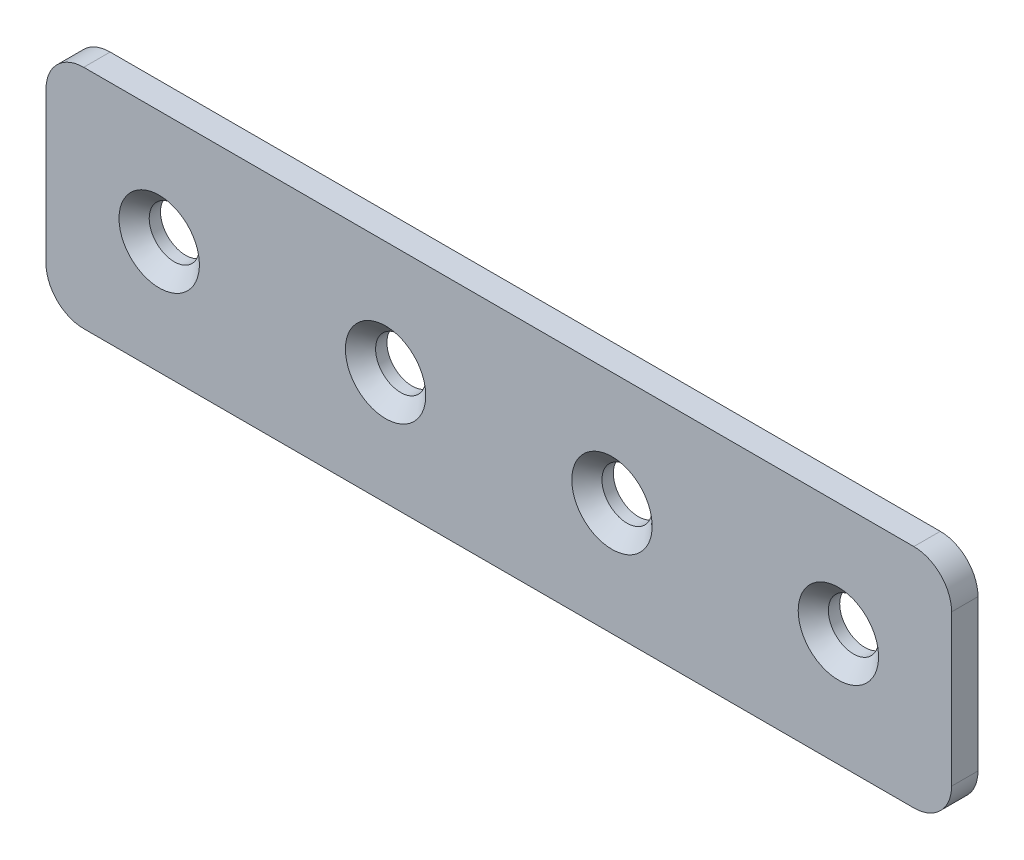
ISO-10303-21;
HEADER;
FILE_DESCRIPTION(('STEP AP214'),'2;1');
FILE_NAME('part.step','',(''),(''),'','','');
FILE_SCHEMA(('AUTOMOTIVE_DESIGN { 1 0 10303 214 1 1 1 1 }'));
ENDSEC;
DATA;
#1=APPLICATION_CONTEXT('core data for automotive mechanical design processes');
#2=APPLICATION_PROTOCOL_DEFINITION('international standard','automotive_design',2000,#1);
#3=PRODUCT_CONTEXT('',#1,'mechanical');
#4=PRODUCT('Part','Part','',(#3));
#5=PRODUCT_RELATED_PRODUCT_CATEGORY('part','',(#4));
#6=PRODUCT_DEFINITION_FORMATION('','',#4);
#7=PRODUCT_DEFINITION_CONTEXT('part definition',#1,'design');
#8=PRODUCT_DEFINITION('design','',#6,#7);
#9=PRODUCT_DEFINITION_SHAPE('','',#8);
#10=(LENGTH_UNIT() NAMED_UNIT(*) SI_UNIT(.MILLI.,.METRE.));
#11=(NAMED_UNIT(*) PLANE_ANGLE_UNIT() SI_UNIT($,.RADIAN.));
#12=(NAMED_UNIT(*) SI_UNIT($,.STERADIAN.) SOLID_ANGLE_UNIT());
#13=UNCERTAINTY_MEASURE_WITH_UNIT(LENGTH_MEASURE(1.E-05),#10,'distance_accuracy_value','');
#14=(GEOMETRIC_REPRESENTATION_CONTEXT(3) GLOBAL_UNCERTAINTY_ASSIGNED_CONTEXT((#13)) GLOBAL_UNIT_ASSIGNED_CONTEXT((#10,
#11,#12)) REPRESENTATION_CONTEXT('',''));
#15=CARTESIAN_POINT('',(0.,0.,0.));
#16=DIRECTION('',(0.,0.,1.));
#17=DIRECTION('',(1.,0.,0.));
#18=AXIS2_PLACEMENT_3D('',#15,#16,#17);
#19=CARTESIAN_POINT('',(0.,0.,0.));
#20=DIRECTION('',(0.,0.,1.));
#21=DIRECTION('',(1.,0.,0.));
#22=AXIS2_PLACEMENT_3D('',#19,#20,#21);
#23=PLANE('',#22);
#24=CARTESIAN_POINT('',(45.,0.,0.));
#25=DIRECTION('',(0.,0.,-1.));
#26=DIRECTION('',(1.,0.,0.));
#27=AXIS2_PLACEMENT_3D('',#24,#25,#26);
#28=CIRCLE('',#27,3.325);
#29=CARTESIAN_POINT('',(41.675,0.,0.));
#30=VERTEX_POINT('',#29);
#31=EDGE_CURVE('E220',#30,#30,#28,.T.);
#32=ORIENTED_EDGE('',*,*,#31,.F.);
#33=EDGE_LOOP('',(#32));
#34=FACE_BOUND('',#33,.T.);
#35=CARTESIAN_POINT('',(-15.,0.,0.));
#36=DIRECTION('',(0.,0.,-1.));
#37=DIRECTION('',(1.,0.,0.));
#38=AXIS2_PLACEMENT_3D('',#35,#36,#37);
#39=CIRCLE('',#38,3.325);
#40=CARTESIAN_POINT('',(-18.325,0.,0.));
#41=VERTEX_POINT('',#40);
#42=EDGE_CURVE('E218',#41,#41,#39,.T.);
#43=ORIENTED_EDGE('',*,*,#42,.F.);
#44=EDGE_LOOP('',(#43));
#45=FACE_BOUND('',#44,.T.);
#46=CARTESIAN_POINT('',(15.,0.,0.));
#47=DIRECTION('',(0.,0.,-1.));
#48=DIRECTION('',(1.,0.,0.));
#49=AXIS2_PLACEMENT_3D('',#46,#47,#48);
#50=CIRCLE('',#49,3.325);
#51=CARTESIAN_POINT('',(11.675,0.,0.));
#52=VERTEX_POINT('',#51);
#53=EDGE_CURVE('E193',#52,#52,#50,.T.);
#54=ORIENTED_EDGE('',*,*,#53,.F.);
#55=EDGE_LOOP('',(#54));
#56=FACE_BOUND('',#55,.T.);
#57=CARTESIAN_POINT('',(-45.,0.,0.));
#58=DIRECTION('',(0.,0.,-1.));
#59=DIRECTION('',(1.,0.,0.));
#60=AXIS2_PLACEMENT_3D('',#57,#58,#59);
#61=CIRCLE('',#60,3.325);
#62=CARTESIAN_POINT('',(-48.325,0.,0.));
#63=VERTEX_POINT('',#62);
#64=EDGE_CURVE('E257',#63,#63,#61,.T.);
#65=ORIENTED_EDGE('',*,*,#64,.F.);
#66=EDGE_LOOP('',(#65));
#67=FACE_BOUND('',#66,.T.);
#68=CARTESIAN_POINT('',(-55.,10.,0.));
#69=DIRECTION('',(0.,0.,1.));
#70=DIRECTION('',(0.,1.,0.));
#71=AXIS2_PLACEMENT_3D('',#68,#69,#70);
#72=CIRCLE('',#71,5.);
#73=CARTESIAN_POINT('',(-55.,15.,0.));
#74=VERTEX_POINT('',#73);
#75=CARTESIAN_POINT('',(-60.,10.,0.));
#76=VERTEX_POINT('',#75);
#77=EDGE_CURVE('E10',#74,#76,#72,.T.);
#78=ORIENTED_EDGE('',*,*,#77,.F.);
#79=DIRECTION('',(1.,0.,0.));
#80=VECTOR('',#79,1.);
#81=CARTESIAN_POINT('',(-55.,15.,0.));
#82=LINE('',#81,#80);
#83=CARTESIAN_POINT('',(55.,15.,0.));
#84=VERTEX_POINT('',#83);
#85=EDGE_CURVE('E223',#74,#84,#82,.T.);
#86=ORIENTED_EDGE('',*,*,#85,.T.);
#87=CARTESIAN_POINT('',(55.,10.,0.));
#88=DIRECTION('',(0.,0.,1.));
#89=DIRECTION('',(1.,0.,0.));
#90=AXIS2_PLACEMENT_3D('',#87,#88,#89);
#91=CIRCLE('',#90,5.);
#92=CARTESIAN_POINT('',(60.,10.,0.));
#93=VERTEX_POINT('',#92);
#94=EDGE_CURVE('E228',#93,#84,#91,.T.);
#95=ORIENTED_EDGE('',*,*,#94,.F.);
#96=DIRECTION('',(0.,-1.,0.));
#97=VECTOR('',#96,1.);
#98=CARTESIAN_POINT('',(60.,10.,0.));
#99=LINE('',#98,#97);
#100=CARTESIAN_POINT('',(60.,-10.,0.));
#101=VERTEX_POINT('',#100);
#102=EDGE_CURVE('E227',#93,#101,#99,.T.);
#103=ORIENTED_EDGE('',*,*,#102,.T.);
#104=CARTESIAN_POINT('',(55.,-10.,0.));
#105=DIRECTION('',(0.,0.,1.));
#106=DIRECTION('',(0.,-1.,0.));
#107=AXIS2_PLACEMENT_3D('',#104,#105,#106);
#108=CIRCLE('',#107,5.);
#109=CARTESIAN_POINT('',(55.,-15.,0.));
#110=VERTEX_POINT('',#109);
#111=EDGE_CURVE('E161',#110,#101,#108,.T.);
#112=ORIENTED_EDGE('',*,*,#111,.F.);
#113=DIRECTION('',(-1.,0.,0.));
#114=VECTOR('',#113,1.);
#115=CARTESIAN_POINT('',(55.,-15.,0.));
#116=LINE('',#115,#114);
#117=CARTESIAN_POINT('',(-55.,-15.,0.));
#118=VERTEX_POINT('',#117);
#119=EDGE_CURVE('E126',#110,#118,#116,.T.);
#120=ORIENTED_EDGE('',*,*,#119,.T.);
#121=CARTESIAN_POINT('',(-55.,-10.,0.));
#122=DIRECTION('',(0.,0.,1.));
#123=DIRECTION('',(-1.,0.,0.));
#124=AXIS2_PLACEMENT_3D('',#121,#122,#123);
#125=CIRCLE('',#124,5.);
#126=CARTESIAN_POINT('',(-60.,-10.,0.));
#127=VERTEX_POINT('',#126);
#128=EDGE_CURVE('E136',#127,#118,#125,.T.);
#129=ORIENTED_EDGE('',*,*,#128,.F.);
#130=DIRECTION('',(0.,1.,0.));
#131=VECTOR('',#130,1.);
#132=CARTESIAN_POINT('',(-60.,-10.,0.));
#133=LINE('',#132,#131);
#134=EDGE_CURVE('E198',#127,#76,#133,.T.);
#135=ORIENTED_EDGE('',*,*,#134,.T.);
#136=EDGE_LOOP('',(#78,#86,#95,#103,#112,#120,#129,#135));
#137=FACE_BOUND('',#136,.T.);
#138=ADVANCED_FACE('F15',(#34,#45,#56,#67,#137),#23,.F.);
#139=CARTESIAN_POINT('',(-55.,10.,0.));
#140=DIRECTION('',(0.,0.,1.));
#141=DIRECTION('',(0.,1.,0.));
#142=AXIS2_PLACEMENT_3D('',#139,#140,#141);
#143=CYLINDRICAL_SURFACE('',#142,5.);
#144=ORIENTED_EDGE('',*,*,#77,.T.);
#145=DIRECTION('',(0.,0.,1.));
#146=VECTOR('',#145,1.);
#147=CARTESIAN_POINT('',(-60.,10.,0.));
#148=LINE('',#147,#146);
#149=CARTESIAN_POINT('',(-60.,10.,3.5));
#150=VERTEX_POINT('',#149);
#151=EDGE_CURVE('E26',#76,#150,#148,.T.);
#152=ORIENTED_EDGE('',*,*,#151,.T.);
#153=CARTESIAN_POINT('',(-55.,10.,3.5));
#154=DIRECTION('',(0.,0.,1.));
#155=DIRECTION('',(0.,1.,0.));
#156=AXIS2_PLACEMENT_3D('',#153,#154,#155);
#157=CIRCLE('',#156,5.);
#158=CARTESIAN_POINT('',(-55.,15.,3.5));
#159=VERTEX_POINT('',#158);
#160=EDGE_CURVE('E262',#159,#150,#157,.T.);
#161=ORIENTED_EDGE('',*,*,#160,.F.);
#162=DIRECTION('',(0.,0.,1.));
#163=VECTOR('',#162,1.);
#164=CARTESIAN_POINT('',(-55.,15.,0.));
#165=LINE('',#164,#163);
#166=EDGE_CURVE('E294',#74,#159,#165,.T.);
#167=ORIENTED_EDGE('',*,*,#166,.F.);
#168=EDGE_LOOP('',(#144,#152,#161,#167));
#169=FACE_BOUND('',#168,.T.);
#170=ADVANCED_FACE('F350',(#169),#143,.T.);
#171=CARTESIAN_POINT('',(-60.,10.,0.));
#172=DIRECTION('',(-1.,0.,0.));
#173=DIRECTION('',(0.,1.,0.));
#174=AXIS2_PLACEMENT_3D('',#171,#172,#173);
#175=PLANE('',#174);
#176=ORIENTED_EDGE('',*,*,#134,.F.);
#177=DIRECTION('',(0.,0.,1.));
#178=VECTOR('',#177,1.);
#179=CARTESIAN_POINT('',(-60.,-10.,0.));
#180=LINE('',#179,#178);
#181=CARTESIAN_POINT('',(-60.,-10.,3.5));
#182=VERTEX_POINT('',#181);
#183=EDGE_CURVE('E202',#127,#182,#180,.T.);
#184=ORIENTED_EDGE('',*,*,#183,.T.);
#185=DIRECTION('',(0.,-1.,0.));
#186=VECTOR('',#185,1.);
#187=CARTESIAN_POINT('',(-60.,-10.,3.5));
#188=LINE('',#187,#186);
#189=EDGE_CURVE('E185',#150,#182,#188,.T.);
#190=ORIENTED_EDGE('',*,*,#189,.F.);
#191=ORIENTED_EDGE('',*,*,#151,.F.);
#192=EDGE_LOOP('',(#176,#184,#190,#191));
#193=FACE_BOUND('',#192,.T.);
#194=ADVANCED_FACE('F356',(#193),#175,.T.);
#195=CARTESIAN_POINT('',(-55.,-10.,0.));
#196=DIRECTION('',(0.,0.,1.));
#197=DIRECTION('',(-1.,0.,0.));
#198=AXIS2_PLACEMENT_3D('',#195,#196,#197);
#199=CYLINDRICAL_SURFACE('',#198,5.);
#200=ORIENTED_EDGE('',*,*,#128,.T.);
#201=DIRECTION('',(0.,0.,1.));
#202=VECTOR('',#201,1.);
#203=CARTESIAN_POINT('',(-55.,-15.,0.));
#204=LINE('',#203,#202);
#205=CARTESIAN_POINT('',(-55.,-15.,3.5));
#206=VERTEX_POINT('',#205);
#207=EDGE_CURVE('E190',#118,#206,#204,.T.);
#208=ORIENTED_EDGE('',*,*,#207,.T.);
#209=CARTESIAN_POINT('',(-55.,-10.,3.5));
#210=DIRECTION('',(0.,0.,1.));
#211=DIRECTION('',(-1.,0.,0.));
#212=AXIS2_PLACEMENT_3D('',#209,#210,#211);
#213=CIRCLE('',#212,5.);
#214=EDGE_CURVE('E178',#182,#206,#213,.T.);
#215=ORIENTED_EDGE('',*,*,#214,.F.);
#216=ORIENTED_EDGE('',*,*,#183,.F.);
#217=EDGE_LOOP('',(#200,#208,#215,#216));
#218=FACE_BOUND('',#217,.T.);
#219=ADVANCED_FACE('F366',(#218),#199,.T.);
#220=CARTESIAN_POINT('',(-55.,-15.,0.));
#221=DIRECTION('',(0.,-1.,0.));
#222=DIRECTION('',(-1.,0.,0.));
#223=AXIS2_PLACEMENT_3D('',#220,#221,#222);
#224=PLANE('',#223);
#225=ORIENTED_EDGE('',*,*,#119,.F.);
#226=DIRECTION('',(0.,0.,1.));
#227=VECTOR('',#226,1.);
#228=CARTESIAN_POINT('',(55.,-15.,0.));
#229=LINE('',#228,#227);
#230=CARTESIAN_POINT('',(55.,-15.,3.5));
#231=VERTEX_POINT('',#230);
#232=EDGE_CURVE('E152',#110,#231,#229,.T.);
#233=ORIENTED_EDGE('',*,*,#232,.T.);
#234=DIRECTION('',(1.,0.,0.));
#235=VECTOR('',#234,1.);
#236=CARTESIAN_POINT('',(55.,-15.,3.5));
#237=LINE('',#236,#235);
#238=EDGE_CURVE('E156',#206,#231,#237,.T.);
#239=ORIENTED_EDGE('',*,*,#238,.F.);
#240=ORIENTED_EDGE('',*,*,#207,.F.);
#241=EDGE_LOOP('',(#225,#233,#239,#240));
#242=FACE_BOUND('',#241,.T.);
#243=ADVANCED_FACE('F154',(#242),#224,.T.);
#244=CARTESIAN_POINT('',(55.,-10.,0.));
#245=DIRECTION('',(0.,0.,1.));
#246=DIRECTION('',(0.,-1.,0.));
#247=AXIS2_PLACEMENT_3D('',#244,#245,#246);
#248=CYLINDRICAL_SURFACE('',#247,5.);
#249=ORIENTED_EDGE('',*,*,#111,.T.);
#250=DIRECTION('',(0.,0.,1.));
#251=VECTOR('',#250,1.);
#252=CARTESIAN_POINT('',(60.,-10.,0.));
#253=LINE('',#252,#251);
#254=CARTESIAN_POINT('',(60.,-10.,3.5));
#255=VERTEX_POINT('',#254);
#256=EDGE_CURVE('E167',#101,#255,#253,.T.);
#257=ORIENTED_EDGE('',*,*,#256,.T.);
#258=CARTESIAN_POINT('',(55.,-10.,3.5));
#259=DIRECTION('',(0.,0.,1.));
#260=DIRECTION('',(0.,-1.,0.));
#261=AXIS2_PLACEMENT_3D('',#258,#259,#260);
#262=CIRCLE('',#261,5.);
#263=EDGE_CURVE('E164',#231,#255,#262,.T.);
#264=ORIENTED_EDGE('',*,*,#263,.F.);
#265=ORIENTED_EDGE('',*,*,#232,.F.);
#266=EDGE_LOOP('',(#249,#257,#264,#265));
#267=FACE_BOUND('',#266,.T.);
#268=ADVANCED_FACE('F165',(#267),#248,.T.);
#269=CARTESIAN_POINT('',(60.,-10.,0.));
#270=DIRECTION('',(1.,0.,0.));
#271=DIRECTION('',(0.,1.,0.));
#272=AXIS2_PLACEMENT_3D('',#269,#270,#271);
#273=PLANE('',#272);
#274=ORIENTED_EDGE('',*,*,#102,.F.);
#275=DIRECTION('',(0.,0.,1.));
#276=VECTOR('',#275,1.);
#277=CARTESIAN_POINT('',(60.,10.,0.));
#278=LINE('',#277,#276);
#279=CARTESIAN_POINT('',(60.,10.,3.5));
#280=VERTEX_POINT('',#279);
#281=EDGE_CURVE('E225',#93,#280,#278,.T.);
#282=ORIENTED_EDGE('',*,*,#281,.T.);
#283=DIRECTION('',(0.,1.,0.));
#284=VECTOR('',#283,1.);
#285=CARTESIAN_POINT('',(60.,10.,3.5));
#286=LINE('',#285,#284);
#287=EDGE_CURVE('E172',#255,#280,#286,.T.);
#288=ORIENTED_EDGE('',*,*,#287,.F.);
#289=ORIENTED_EDGE('',*,*,#256,.F.);
#290=EDGE_LOOP('',(#274,#282,#288,#289));
#291=FACE_BOUND('',#290,.T.);
#292=ADVANCED_FACE('F370',(#291),#273,.T.);
#293=CARTESIAN_POINT('',(55.,10.,0.));
#294=DIRECTION('',(0.,0.,1.));
#295=DIRECTION('',(1.,0.,0.));
#296=AXIS2_PLACEMENT_3D('',#293,#294,#295);
#297=CYLINDRICAL_SURFACE('',#296,5.);
#298=ORIENTED_EDGE('',*,*,#94,.T.);
#299=DIRECTION('',(0.,0.,1.));
#300=VECTOR('',#299,1.);
#301=CARTESIAN_POINT('',(55.,15.,0.));
#302=LINE('',#301,#300);
#303=CARTESIAN_POINT('',(55.,15.,3.5));
#304=VERTEX_POINT('',#303);
#305=EDGE_CURVE('E244',#84,#304,#302,.T.);
#306=ORIENTED_EDGE('',*,*,#305,.T.);
#307=CARTESIAN_POINT('',(55.,10.,3.5));
#308=DIRECTION('',(0.,0.,1.));
#309=DIRECTION('',(1.,0.,0.));
#310=AXIS2_PLACEMENT_3D('',#307,#308,#309);
#311=CIRCLE('',#310,5.);
#312=EDGE_CURVE('E234',#280,#304,#311,.T.);
#313=ORIENTED_EDGE('',*,*,#312,.F.);
#314=ORIENTED_EDGE('',*,*,#281,.F.);
#315=EDGE_LOOP('',(#298,#306,#313,#314));
#316=FACE_BOUND('',#315,.T.);
#317=ADVANCED_FACE('F374',(#316),#297,.T.);
#318=CARTESIAN_POINT('',(55.,15.,0.));
#319=DIRECTION('',(0.,1.,0.));
#320=DIRECTION('',(1.,0.,0.));
#321=AXIS2_PLACEMENT_3D('',#318,#319,#320);
#322=PLANE('',#321);
#323=ORIENTED_EDGE('',*,*,#85,.F.);
#324=ORIENTED_EDGE('',*,*,#166,.T.);
#325=DIRECTION('',(-1.,0.,0.));
#326=VECTOR('',#325,1.);
#327=CARTESIAN_POINT('',(-55.,15.,3.5));
#328=LINE('',#327,#326);
#329=EDGE_CURVE('E250',#304,#159,#328,.T.);
#330=ORIENTED_EDGE('',*,*,#329,.F.);
#331=ORIENTED_EDGE('',*,*,#305,.F.);
#332=EDGE_LOOP('',(#323,#324,#330,#331));
#333=FACE_BOUND('',#332,.T.);
#334=ADVANCED_FACE('F380',(#333),#322,.T.);
#335=CARTESIAN_POINT('',(45.,0.,0.));
#336=DIRECTION('',(0.,0.,1.));
#337=DIRECTION('',(1.,0.,0.));
#338=AXIS2_PLACEMENT_3D('',#335,#336,#337);
#339=CYLINDRICAL_SURFACE('',#338,3.325);
#340=CARTESIAN_POINT('',(45.,0.,1.5));
#341=DIRECTION('',(0.,0.,-1.));
#342=DIRECTION('',(1.,0.,0.));
#343=AXIS2_PLACEMENT_3D('',#340,#341,#342);
#344=CIRCLE('',#343,3.325);
#345=CARTESIAN_POINT('',(41.675,0.,1.5));
#346=VERTEX_POINT('',#345);
#347=EDGE_CURVE('E238',#346,#346,#344,.T.);
#348=ORIENTED_EDGE('',*,*,#347,.F.);
#349=DIRECTION('',(0.,0.,-1.));
#350=VECTOR('',#349,1.);
#351=CARTESIAN_POINT('',(41.675,0.,0.));
#352=LINE('',#351,#350);
#353=EDGE_CURVE('E224',#346,#30,#352,.T.);
#354=ORIENTED_EDGE('',*,*,#353,.T.);
#355=ORIENTED_EDGE('',*,*,#31,.T.);
#356=ORIENTED_EDGE('',*,*,#353,.F.);
#357=EDGE_LOOP('',(#348,#354,#355,#356));
#358=FACE_BOUND('',#357,.T.);
#359=ADVANCED_FACE('F362',(#358),#339,.F.);
#360=CARTESIAN_POINT('',(45.,0.,2.5));
#361=DIRECTION('',(0.,0.,1.));
#362=DIRECTION('',(1.,0.,0.));
#363=AXIS2_PLACEMENT_3D('',#360,#361,#362);
#364=CONICAL_SURFACE('',#363,4.325,0.785398163397449);
#365=CARTESIAN_POINT('',(45.,0.,3.5));
#366=DIRECTION('',(0.,0.,1.));
#367=DIRECTION('',(1.,0.,0.));
#368=AXIS2_PLACEMENT_3D('',#365,#366,#367);
#369=CIRCLE('',#368,5.325);
#370=CARTESIAN_POINT('',(39.675,0.,3.5));
#371=VERTEX_POINT('',#370);
#372=EDGE_CURVE('E208',#371,#371,#369,.T.);
#373=ORIENTED_EDGE('',*,*,#372,.T.);
#374=DIRECTION('',(0.707106781186548,0.,-0.707106781186547));
#375=VECTOR('',#374,1.);
#376=CARTESIAN_POINT('',(40.675,0.,2.5));
#377=LINE('',#376,#375);
#378=EDGE_CURVE('E196',#371,#346,#377,.T.);
#379=ORIENTED_EDGE('',*,*,#378,.T.);
#380=ORIENTED_EDGE('',*,*,#347,.T.);
#381=ORIENTED_EDGE('',*,*,#378,.F.);
#382=EDGE_LOOP('',(#373,#379,#380,#381));
#383=FACE_BOUND('',#382,.T.);
#384=ADVANCED_FACE('F392',(#383),#364,.F.);
#385=CARTESIAN_POINT('',(15.,0.,0.));
#386=DIRECTION('',(0.,0.,1.));
#387=DIRECTION('',(1.,0.,0.));
#388=AXIS2_PLACEMENT_3D('',#385,#386,#387);
#389=CYLINDRICAL_SURFACE('',#388,3.325);
#390=CARTESIAN_POINT('',(15.,0.,1.5));
#391=DIRECTION('',(0.,0.,-1.));
#392=DIRECTION('',(1.,0.,0.));
#393=AXIS2_PLACEMENT_3D('',#390,#391,#392);
#394=CIRCLE('',#393,3.325);
#395=CARTESIAN_POINT('',(11.675,0.,1.5));
#396=VERTEX_POINT('',#395);
#397=EDGE_CURVE('E253',#396,#396,#394,.T.);
#398=ORIENTED_EDGE('',*,*,#397,.F.);
#399=DIRECTION('',(0.,0.,-1.));
#400=VECTOR('',#399,1.);
#401=CARTESIAN_POINT('',(11.675,0.,0.));
#402=LINE('',#401,#400);
#403=EDGE_CURVE('E197',#396,#52,#402,.T.);
#404=ORIENTED_EDGE('',*,*,#403,.T.);
#405=ORIENTED_EDGE('',*,*,#53,.T.);
#406=ORIENTED_EDGE('',*,*,#403,.F.);
#407=EDGE_LOOP('',(#398,#404,#405,#406));
#408=FACE_BOUND('',#407,.T.);
#409=ADVANCED_FACE('F345',(#408),#389,.F.);
#410=CARTESIAN_POINT('',(15.,0.,2.5));
#411=DIRECTION('',(0.,0.,1.));
#412=DIRECTION('',(1.,0.,0.));
#413=AXIS2_PLACEMENT_3D('',#410,#411,#412);
#414=CONICAL_SURFACE('',#413,4.325,0.785398163397449);
#415=CARTESIAN_POINT('',(15.,0.,3.5));
#416=DIRECTION('',(0.,0.,1.));
#417=DIRECTION('',(1.,0.,0.));
#418=AXIS2_PLACEMENT_3D('',#415,#416,#417);
#419=CIRCLE('',#418,5.325);
#420=CARTESIAN_POINT('',(9.675,0.,3.5));
#421=VERTEX_POINT('',#420);
#422=EDGE_CURVE('E212',#421,#421,#419,.T.);
#423=ORIENTED_EDGE('',*,*,#422,.T.);
#424=DIRECTION('',(0.707106781186548,0.,-0.707106781186547));
#425=VECTOR('',#424,1.);
#426=CARTESIAN_POINT('',(10.675,0.,2.5));
#427=LINE('',#426,#425);
#428=EDGE_CURVE('E19',#421,#396,#427,.T.);
#429=ORIENTED_EDGE('',*,*,#428,.T.);
#430=ORIENTED_EDGE('',*,*,#397,.T.);
#431=ORIENTED_EDGE('',*,*,#428,.F.);
#432=EDGE_LOOP('',(#423,#429,#430,#431));
#433=FACE_BOUND('',#432,.T.);
#434=ADVANCED_FACE('F321',(#433),#414,.F.);
#435=CARTESIAN_POINT('',(-15.,0.,0.));
#436=DIRECTION('',(0.,0.,1.));
#437=DIRECTION('',(1.,0.,0.));
#438=AXIS2_PLACEMENT_3D('',#435,#436,#437);
#439=CYLINDRICAL_SURFACE('',#438,3.325);
#440=CARTESIAN_POINT('',(-15.,0.,1.5));
#441=DIRECTION('',(0.,0.,-1.));
#442=DIRECTION('',(1.,0.,0.));
#443=AXIS2_PLACEMENT_3D('',#440,#441,#442);
#444=CIRCLE('',#443,3.325);
#445=CARTESIAN_POINT('',(-18.325,0.,1.5));
#446=VERTEX_POINT('',#445);
#447=EDGE_CURVE('E219',#446,#446,#444,.T.);
#448=ORIENTED_EDGE('',*,*,#447,.F.);
#449=DIRECTION('',(0.,0.,-1.));
#450=VECTOR('',#449,1.);
#451=CARTESIAN_POINT('',(-18.325,0.,0.));
#452=LINE('',#451,#450);
#453=EDGE_CURVE('E214',#446,#41,#452,.T.);
#454=ORIENTED_EDGE('',*,*,#453,.T.);
#455=ORIENTED_EDGE('',*,*,#42,.T.);
#456=ORIENTED_EDGE('',*,*,#453,.F.);
#457=EDGE_LOOP('',(#448,#454,#455,#456));
#458=FACE_BOUND('',#457,.T.);
#459=ADVANCED_FACE('F336',(#458),#439,.F.);
#460=CARTESIAN_POINT('',(-15.,0.,2.5));
#461=DIRECTION('',(0.,0.,1.));
#462=DIRECTION('',(1.,0.,0.));
#463=AXIS2_PLACEMENT_3D('',#460,#461,#462);
#464=CONICAL_SURFACE('',#463,4.325,0.785398163397448);
#465=CARTESIAN_POINT('',(-15.,0.,3.5));
#466=DIRECTION('',(0.,0.,1.));
#467=DIRECTION('',(1.,0.,0.));
#468=AXIS2_PLACEMENT_3D('',#465,#466,#467);
#469=CIRCLE('',#468,5.325);
#470=CARTESIAN_POINT('',(-20.325,0.,3.5));
#471=VERTEX_POINT('',#470);
#472=EDGE_CURVE('E213',#471,#471,#469,.T.);
#473=ORIENTED_EDGE('',*,*,#472,.T.);
#474=DIRECTION('',(0.707106781186547,0.,-0.707106781186548));
#475=VECTOR('',#474,1.);
#476=CARTESIAN_POINT('',(-19.325,0.,2.5));
#477=LINE('',#476,#475);
#478=EDGE_CURVE('E260',#471,#446,#477,.T.);
#479=ORIENTED_EDGE('',*,*,#478,.T.);
#480=ORIENTED_EDGE('',*,*,#447,.T.);
#481=ORIENTED_EDGE('',*,*,#478,.F.);
#482=EDGE_LOOP('',(#473,#479,#480,#481));
#483=FACE_BOUND('',#482,.T.);
#484=ADVANCED_FACE('F334',(#483),#464,.F.);
#485=CARTESIAN_POINT('',(-45.,0.,0.));
#486=DIRECTION('',(0.,0.,1.));
#487=DIRECTION('',(1.,0.,0.));
#488=AXIS2_PLACEMENT_3D('',#485,#486,#487);
#489=CYLINDRICAL_SURFACE('',#488,3.325);
#490=CARTESIAN_POINT('',(-45.,0.,1.5));
#491=DIRECTION('',(0.,0.,-1.));
#492=DIRECTION('',(1.,0.,0.));
#493=AXIS2_PLACEMENT_3D('',#490,#491,#492);
#494=CIRCLE('',#493,3.325);
#495=CARTESIAN_POINT('',(-48.325,0.,1.5));
#496=VERTEX_POINT('',#495);
#497=EDGE_CURVE('E207',#496,#496,#494,.T.);
#498=ORIENTED_EDGE('',*,*,#497,.F.);
#499=DIRECTION('',(0.,0.,-1.));
#500=VECTOR('',#499,1.);
#501=CARTESIAN_POINT('',(-48.325,0.,0.));
#502=LINE('',#501,#500);
#503=EDGE_CURVE('E261',#496,#63,#502,.T.);
#504=ORIENTED_EDGE('',*,*,#503,.T.);
#505=ORIENTED_EDGE('',*,*,#64,.T.);
#506=ORIENTED_EDGE('',*,*,#503,.F.);
#507=EDGE_LOOP('',(#498,#504,#505,#506));
#508=FACE_BOUND('',#507,.T.);
#509=ADVANCED_FACE('F17',(#508),#489,.F.);
#510=CARTESIAN_POINT('',(0.,0.,3.5));
#511=DIRECTION('',(0.,0.,1.));
#512=DIRECTION('',(1.,0.,0.));
#513=AXIS2_PLACEMENT_3D('',#510,#511,#512);
#514=PLANE('',#513);
#515=CARTESIAN_POINT('',(-45.,0.,3.5));
#516=DIRECTION('',(0.,0.,1.));
#517=DIRECTION('',(1.,0.,0.));
#518=AXIS2_PLACEMENT_3D('',#515,#516,#517);
#519=CIRCLE('',#518,5.325);
#520=CARTESIAN_POINT('',(-50.325,0.,3.5));
#521=VERTEX_POINT('',#520);
#522=EDGE_CURVE('E189',#521,#521,#519,.T.);
#523=ORIENTED_EDGE('',*,*,#522,.F.);
#524=EDGE_LOOP('',(#523));
#525=FACE_BOUND('',#524,.T.);
#526=ORIENTED_EDGE('',*,*,#422,.F.);
#527=EDGE_LOOP('',(#526));
#528=FACE_BOUND('',#527,.T.);
#529=ORIENTED_EDGE('',*,*,#372,.F.);
#530=EDGE_LOOP('',(#529));
#531=FACE_BOUND('',#530,.T.);
#532=ORIENTED_EDGE('',*,*,#472,.F.);
#533=EDGE_LOOP('',(#532));
#534=FACE_BOUND('',#533,.T.);
#535=ORIENTED_EDGE('',*,*,#160,.T.);
#536=ORIENTED_EDGE('',*,*,#189,.T.);
#537=ORIENTED_EDGE('',*,*,#214,.T.);
#538=ORIENTED_EDGE('',*,*,#238,.T.);
#539=ORIENTED_EDGE('',*,*,#263,.T.);
#540=ORIENTED_EDGE('',*,*,#287,.T.);
#541=ORIENTED_EDGE('',*,*,#312,.T.);
#542=ORIENTED_EDGE('',*,*,#329,.T.);
#543=EDGE_LOOP('',(#535,#536,#537,#538,#539,#540,#541,#542));
#544=FACE_BOUND('',#543,.T.);
#545=ADVANCED_FACE('F175',(#525,#528,#531,#534,#544),#514,.T.);
#546=CARTESIAN_POINT('',(-45.,0.,2.5));
#547=DIRECTION('',(0.,0.,1.));
#548=DIRECTION('',(1.,0.,0.));
#549=AXIS2_PLACEMENT_3D('',#546,#547,#548);
#550=CONICAL_SURFACE('',#549,4.325,0.785398163397449);
#551=ORIENTED_EDGE('',*,*,#522,.T.);
#552=DIRECTION('',(0.707106781186548,0.,-0.707106781186547));
#553=VECTOR('',#552,1.);
#554=CARTESIAN_POINT('',(-49.325,0.,2.5));
#555=LINE('',#554,#553);
#556=EDGE_CURVE('E203',#521,#496,#555,.T.);
#557=ORIENTED_EDGE('',*,*,#556,.T.);
#558=ORIENTED_EDGE('',*,*,#497,.T.);
#559=ORIENTED_EDGE('',*,*,#556,.F.);
#560=EDGE_LOOP('',(#551,#557,#558,#559));
#561=FACE_BOUND('',#560,.T.);
#562=ADVANCED_FACE('F327',(#561),#550,.F.);
#563=CLOSED_SHELL('',(#138,#170,#194,#219,#243,#268,#292,#317,#334,#359,#384,#409,#434,#459,
#484,#509,#545,#562));
#564=MANIFOLD_SOLID_BREP('B1',#563);
#565=ADVANCED_BREP_SHAPE_REPRESENTATION('',(#18,#564),#14);
#566=SHAPE_DEFINITION_REPRESENTATION(#9,#565);
ENDSEC;
END-ISO-10303-21;
